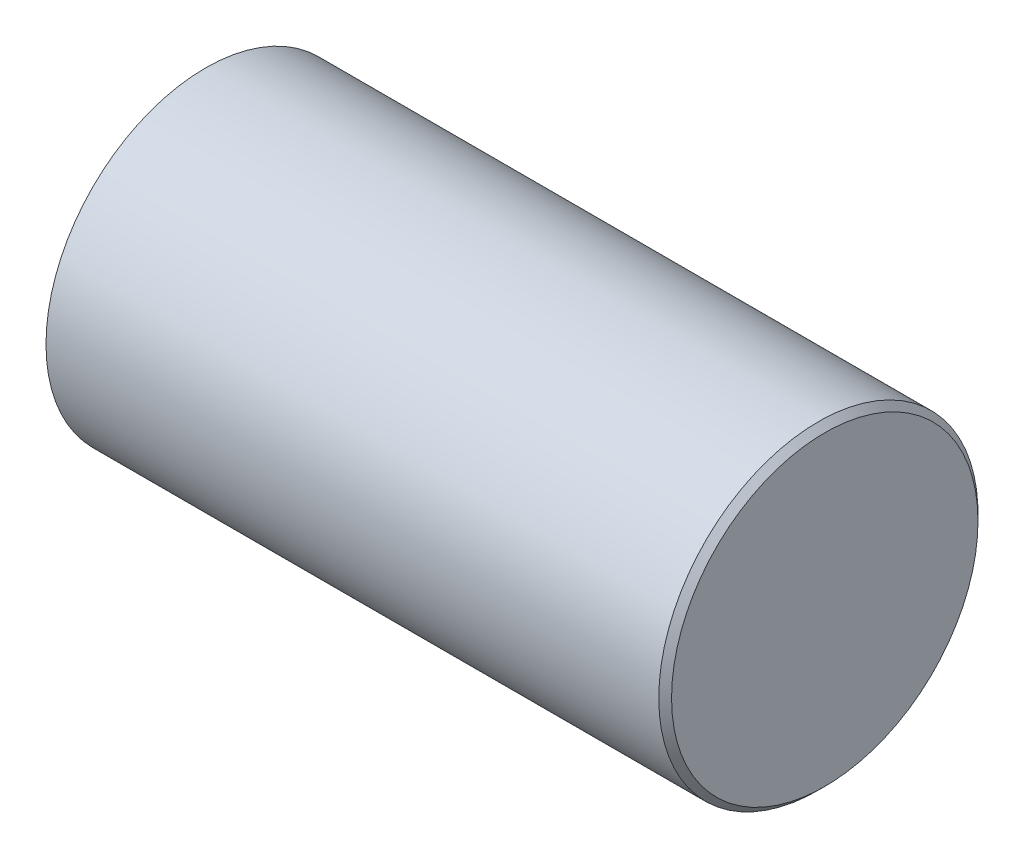
ISO-10303-21;
HEADER;
FILE_DESCRIPTION(('STEP AP214'),'2;1');
FILE_NAME('part.step','',(''),(''),'','','');
FILE_SCHEMA(('AUTOMOTIVE_DESIGN { 1 0 10303 214 1 1 1 1 }'));
ENDSEC;
DATA;
#1=APPLICATION_CONTEXT('core data for automotive mechanical design processes');
#2=APPLICATION_PROTOCOL_DEFINITION('international standard','automotive_design',2000,#1);
#3=PRODUCT_CONTEXT('',#1,'mechanical');
#4=PRODUCT('Part','Part','',(#3));
#5=PRODUCT_RELATED_PRODUCT_CATEGORY('part','',(#4));
#6=PRODUCT_DEFINITION_FORMATION('','',#4);
#7=PRODUCT_DEFINITION_CONTEXT('part definition',#1,'design');
#8=PRODUCT_DEFINITION('design','',#6,#7);
#9=PRODUCT_DEFINITION_SHAPE('','',#8);
#10=(LENGTH_UNIT() NAMED_UNIT(*) SI_UNIT(.MILLI.,.METRE.));
#11=(NAMED_UNIT(*) PLANE_ANGLE_UNIT() SI_UNIT($,.RADIAN.));
#12=(NAMED_UNIT(*) SI_UNIT($,.STERADIAN.) SOLID_ANGLE_UNIT());
#13=UNCERTAINTY_MEASURE_WITH_UNIT(LENGTH_MEASURE(1.E-05),#10,'distance_accuracy_value','');
#14=(GEOMETRIC_REPRESENTATION_CONTEXT(3) GLOBAL_UNCERTAINTY_ASSIGNED_CONTEXT((#13)) GLOBAL_UNIT_ASSIGNED_CONTEXT((#10,
#11,#12)) REPRESENTATION_CONTEXT('',''));
#15=CARTESIAN_POINT('',(0.,0.,0.));
#16=DIRECTION('',(0.,0.,1.));
#17=DIRECTION('',(1.,0.,0.));
#18=AXIS2_PLACEMENT_3D('',#15,#16,#17);
#19=CARTESIAN_POINT('',(0.,0.,0.));
#20=DIRECTION('',(-1.,0.,0.));
#21=DIRECTION('',(0.,0.,1.));
#22=AXIS2_PLACEMENT_3D('',#19,#20,#21);
#23=CYLINDRICAL_SURFACE('',#22,25.);
#24=CARTESIAN_POINT('',(99.,0.,0.));
#25=DIRECTION('',(-1.,0.,0.));
#26=DIRECTION('',(0.,0.,1.));
#27=AXIS2_PLACEMENT_3D('',#24,#25,#26);
#28=CIRCLE('',#27,25.);
#29=CARTESIAN_POINT('',(99.,0.,25.));
#30=VERTEX_POINT('',#29);
#31=EDGE_CURVE('E53',#30,#30,#28,.T.);
#32=ORIENTED_EDGE('',*,*,#31,.T.);
#33=EDGE_LOOP('',(#32));
#34=FACE_BOUND('',#33,.T.);
#35=CARTESIAN_POINT('',(3.01960972814432,0.,0.));
#36=DIRECTION('',(-1.,0.,0.));
#37=DIRECTION('',(0.,0.,1.));
#38=AXIS2_PLACEMENT_3D('',#35,#36,#37);
#39=CIRCLE('',#38,25.);
#40=CARTESIAN_POINT('',(3.01960972814432,0.,25.));
#41=VERTEX_POINT('',#40);
#42=EDGE_CURVE('E58',#41,#41,#39,.T.);
#43=ORIENTED_EDGE('',*,*,#42,.F.);
#44=EDGE_LOOP('',(#43));
#45=FACE_BOUND('',#44,.T.);
#46=ADVANCED_FACE('F44',(#34,#45),#23,.T.);
#47=CARTESIAN_POINT('',(105.,0.,0.));
#48=DIRECTION('',(-1.,0.,0.));
#49=DIRECTION('',(0.,1.,0.));
#50=AXIS2_PLACEMENT_3D('',#47,#48,#49);
#51=SPHERICAL_SURFACE('',#50,105.);
#52=ORIENTED_EDGE('',*,*,#42,.T.);
#53=EDGE_LOOP('',(#52));
#54=FACE_BOUND('',#53,.T.);
#55=ADVANCED_FACE('F66',(#54),#51,.T.);
#56=CARTESIAN_POINT('',(100.,0.,0.));
#57=DIRECTION('',(-1.,0.,0.));
#58=DIRECTION('',(0.,0.,1.));
#59=AXIS2_PLACEMENT_3D('',#56,#57,#58);
#60=PLANE('',#59);
#61=CARTESIAN_POINT('',(100.,0.,0.));
#62=DIRECTION('',(-1.,0.,0.));
#63=DIRECTION('',(0.,0.,1.));
#64=AXIS2_PLACEMENT_3D('',#61,#62,#63);
#65=CIRCLE('',#64,24.);
#66=CARTESIAN_POINT('',(100.,0.,24.));
#67=VERTEX_POINT('',#66);
#68=EDGE_CURVE('E10',#67,#67,#65,.F.);
#69=ORIENTED_EDGE('',*,*,#68,.T.);
#70=EDGE_LOOP('',(#69));
#71=FACE_BOUND('',#70,.T.);
#72=ADVANCED_FACE('F74',(#71),#60,.F.);
#73=CARTESIAN_POINT('',(99.,0.,0.));
#74=DIRECTION('',(-1.,0.,0.));
#75=DIRECTION('',(0.,0.,1.));
#76=AXIS2_PLACEMENT_3D('',#73,#74,#75);
#77=CONICAL_SURFACE('',#76,25.,0.785398163397445);
#78=ORIENTED_EDGE('',*,*,#68,.F.);
#79=EDGE_LOOP('',(#78));
#80=FACE_BOUND('',#79,.T.);
#81=ORIENTED_EDGE('',*,*,#31,.F.);
#82=EDGE_LOOP('',(#81));
#83=FACE_BOUND('',#82,.T.);
#84=ADVANCED_FACE('F47',(#80,#83),#77,.T.);
#85=CLOSED_SHELL('',(#46,#55,#72,#84));
#86=MANIFOLD_SOLID_BREP('B2',#85);
#87=ADVANCED_BREP_SHAPE_REPRESENTATION('',(#18,#86),#14);
#88=SHAPE_DEFINITION_REPRESENTATION(#9,#87);
ENDSEC;
END-ISO-10303-21;
